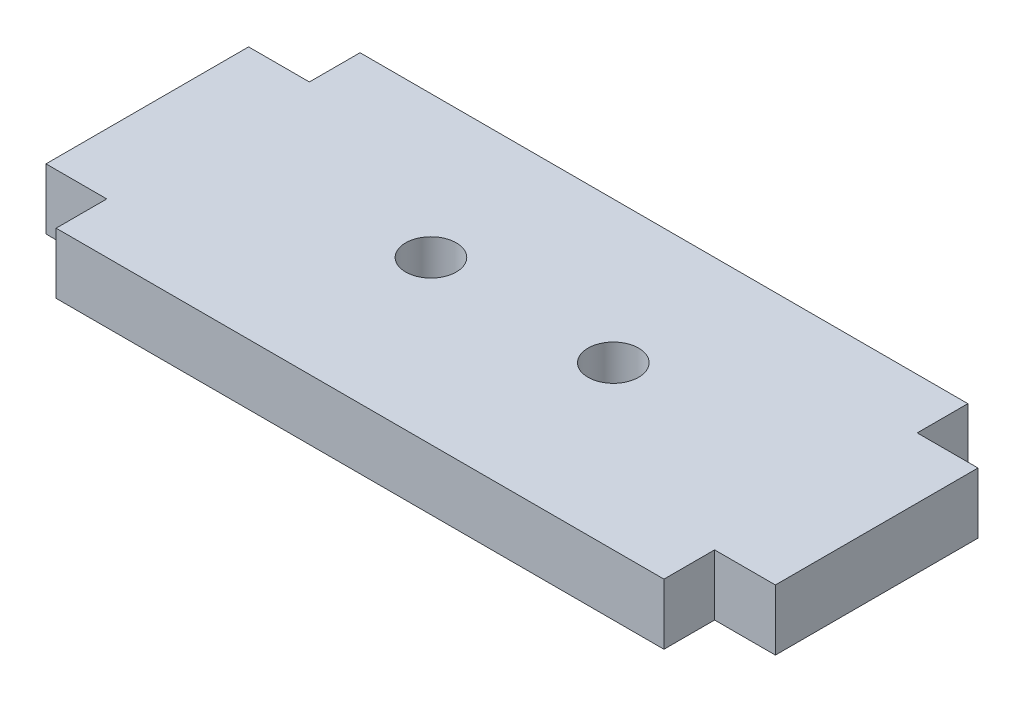
ISO-10303-21;
HEADER;
FILE_DESCRIPTION(('STEP AP214'),'2;1');
FILE_NAME('part.step','',(''),(''),'','','');
FILE_SCHEMA(('AUTOMOTIVE_DESIGN { 1 0 10303 214 1 1 1 1 }'));
ENDSEC;
DATA;
#1=APPLICATION_CONTEXT('core data for automotive mechanical design processes');
#2=APPLICATION_PROTOCOL_DEFINITION('international standard','automotive_design',2000,#1);
#3=PRODUCT_CONTEXT('',#1,'mechanical');
#4=PRODUCT('Part','Part','',(#3));
#5=PRODUCT_RELATED_PRODUCT_CATEGORY('part','',(#4));
#6=PRODUCT_DEFINITION_FORMATION('','',#4);
#7=PRODUCT_DEFINITION_CONTEXT('part definition',#1,'design');
#8=PRODUCT_DEFINITION('design','',#6,#7);
#9=PRODUCT_DEFINITION_SHAPE('','',#8);
#10=(LENGTH_UNIT() NAMED_UNIT(*) SI_UNIT(.MILLI.,.METRE.));
#11=(NAMED_UNIT(*) PLANE_ANGLE_UNIT() SI_UNIT($,.RADIAN.));
#12=(NAMED_UNIT(*) SI_UNIT($,.STERADIAN.) SOLID_ANGLE_UNIT());
#13=UNCERTAINTY_MEASURE_WITH_UNIT(LENGTH_MEASURE(1.E-05),#10,'distance_accuracy_value','');
#14=(GEOMETRIC_REPRESENTATION_CONTEXT(3) GLOBAL_UNCERTAINTY_ASSIGNED_CONTEXT((#13)) GLOBAL_UNIT_ASSIGNED_CONTEXT((#10,
#11,#12)) REPRESENTATION_CONTEXT('',''));
#15=CARTESIAN_POINT('',(0.,0.,0.));
#16=DIRECTION('',(0.,0.,1.));
#17=DIRECTION('',(1.,0.,0.));
#18=AXIS2_PLACEMENT_3D('',#15,#16,#17);
#19=CARTESIAN_POINT('',(0.,3.,0.));
#20=DIRECTION('',(0.,1.,0.));
#21=DIRECTION('',(0.,0.,1.));
#22=AXIS2_PLACEMENT_3D('',#19,#20,#21);
#23=PLANE('',#22);
#24=CARTESIAN_POINT('',(10.5,3.,-8.));
#25=DIRECTION('',(0.,1.,0.));
#26=DIRECTION('',(0.,0.,1.));
#27=AXIS2_PLACEMENT_3D('',#24,#25,#26);
#28=CIRCLE('',#27,1.25);
#29=CARTESIAN_POINT('',(10.5,3.,-6.75));
#30=VERTEX_POINT('',#29);
#31=EDGE_CURVE('E158',#30,#30,#28,.T.);
#32=ORIENTED_EDGE('',*,*,#31,.F.);
#33=EDGE_LOOP('',(#32));
#34=FACE_BOUND('',#33,.T.);
#35=DIRECTION('',(0.,0.,1.));
#36=VECTOR('',#35,1.);
#37=CARTESIAN_POINT('',(0.,3.,0.));
#38=LINE('',#37,#36);
#39=CARTESIAN_POINT('',(0.,3.,-2.5));
#40=VERTEX_POINT('',#39);
#41=CARTESIAN_POINT('',(0.,3.,0.));
#42=VERTEX_POINT('',#41);
#43=EDGE_CURVE('E177',#40,#42,#38,.T.);
#44=ORIENTED_EDGE('',*,*,#43,.T.);
#45=DIRECTION('',(1.,0.,0.));
#46=VECTOR('',#45,1.);
#47=CARTESIAN_POINT('',(0.,3.,0.));
#48=LINE('',#47,#46);
#49=CARTESIAN_POINT('',(30.,3.,0.));
#50=VERTEX_POINT('',#49);
#51=EDGE_CURVE('E105',#42,#50,#48,.T.);
#52=ORIENTED_EDGE('',*,*,#51,.T.);
#53=DIRECTION('',(0.,0.,-1.));
#54=VECTOR('',#53,1.);
#55=CARTESIAN_POINT('',(30.,3.,0.));
#56=LINE('',#55,#54);
#57=CARTESIAN_POINT('',(30.,3.,-2.5));
#58=VERTEX_POINT('',#57);
#59=EDGE_CURVE('E204',#50,#58,#56,.T.);
#60=ORIENTED_EDGE('',*,*,#59,.T.);
#61=DIRECTION('',(1.,0.,0.));
#62=VECTOR('',#61,1.);
#63=CARTESIAN_POINT('',(30.,3.,-2.5));
#64=LINE('',#63,#62);
#65=CARTESIAN_POINT('',(33.,3.,-2.5));
#66=VERTEX_POINT('',#65);
#67=EDGE_CURVE('E223',#58,#66,#64,.T.);
#68=ORIENTED_EDGE('',*,*,#67,.T.);
#69=DIRECTION('',(0.,0.,-1.));
#70=VECTOR('',#69,1.);
#71=CARTESIAN_POINT('',(33.,3.,-12.5));
#72=LINE('',#71,#70);
#73=CARTESIAN_POINT('',(33.,3.,-12.5));
#74=VERTEX_POINT('',#73);
#75=EDGE_CURVE('E220',#66,#74,#72,.T.);
#76=ORIENTED_EDGE('',*,*,#75,.T.);
#77=DIRECTION('',(-1.,0.,0.));
#78=VECTOR('',#77,1.);
#79=CARTESIAN_POINT('',(30.,3.,-12.5));
#80=LINE('',#79,#78);
#81=CARTESIAN_POINT('',(30.,3.,-12.5));
#82=VERTEX_POINT('',#81);
#83=EDGE_CURVE('E222',#74,#82,#80,.T.);
#84=ORIENTED_EDGE('',*,*,#83,.T.);
#85=DIRECTION('',(0.,0.,-1.));
#86=VECTOR('',#85,1.);
#87=CARTESIAN_POINT('',(30.,3.,-12.5));
#88=LINE('',#87,#86);
#89=CARTESIAN_POINT('',(30.,3.,-15.));
#90=VERTEX_POINT('',#89);
#91=EDGE_CURVE('E225',#82,#90,#88,.T.);
#92=ORIENTED_EDGE('',*,*,#91,.T.);
#93=DIRECTION('',(-1.,0.,0.));
#94=VECTOR('',#93,1.);
#95=CARTESIAN_POINT('',(0.,3.,-15.));
#96=LINE('',#95,#94);
#97=CARTESIAN_POINT('',(0.,3.,-15.));
#98=VERTEX_POINT('',#97);
#99=EDGE_CURVE('E231',#90,#98,#96,.T.);
#100=ORIENTED_EDGE('',*,*,#99,.T.);
#101=DIRECTION('',(0.,0.,1.));
#102=VECTOR('',#101,1.);
#103=CARTESIAN_POINT('',(0.,3.,-12.5));
#104=LINE('',#103,#102);
#105=CARTESIAN_POINT('',(0.,3.,-12.5));
#106=VERTEX_POINT('',#105);
#107=EDGE_CURVE('E136',#98,#106,#104,.T.);
#108=ORIENTED_EDGE('',*,*,#107,.T.);
#109=DIRECTION('',(-1.,0.,0.));
#110=VECTOR('',#109,1.);
#111=CARTESIAN_POINT('',(0.,3.,-12.5));
#112=LINE('',#111,#110);
#113=CARTESIAN_POINT('',(-3.,3.,-12.5));
#114=VERTEX_POINT('',#113);
#115=EDGE_CURVE('E130',#106,#114,#112,.T.);
#116=ORIENTED_EDGE('',*,*,#115,.T.);
#117=DIRECTION('',(0.,0.,1.));
#118=VECTOR('',#117,1.);
#119=CARTESIAN_POINT('',(-3.,3.,-12.5));
#120=LINE('',#119,#118);
#121=CARTESIAN_POINT('',(-3.,3.,-2.5));
#122=VERTEX_POINT('',#121);
#123=EDGE_CURVE('E134',#114,#122,#120,.T.);
#124=ORIENTED_EDGE('',*,*,#123,.T.);
#125=DIRECTION('',(1.,0.,0.));
#126=VECTOR('',#125,1.);
#127=CARTESIAN_POINT('',(0.,3.,-2.5));
#128=LINE('',#127,#126);
#129=EDGE_CURVE('E50',#122,#40,#128,.T.);
#130=ORIENTED_EDGE('',*,*,#129,.T.);
#131=EDGE_LOOP('',(#44,#52,#60,#68,#76,#84,#92,#100,#108,#116,#124,#130));
#132=FACE_BOUND('',#131,.T.);
#133=CARTESIAN_POINT('',(19.5,3.,-8.));
#134=DIRECTION('',(0.,1.,0.));
#135=DIRECTION('',(0.,0.,1.));
#136=AXIS2_PLACEMENT_3D('',#133,#134,#135);
#137=CIRCLE('',#136,1.25);
#138=CARTESIAN_POINT('',(19.5,3.,-6.75));
#139=VERTEX_POINT('',#138);
#140=EDGE_CURVE('E273',#139,#139,#137,.T.);
#141=ORIENTED_EDGE('',*,*,#140,.F.);
#142=EDGE_LOOP('',(#141));
#143=FACE_BOUND('',#142,.T.);
#144=ADVANCED_FACE('F33',(#34,#132,#143),#23,.T.);
#145=CARTESIAN_POINT('',(0.,0.,0.));
#146=DIRECTION('',(0.,1.,0.));
#147=DIRECTION('',(0.,0.,1.));
#148=AXIS2_PLACEMENT_3D('',#145,#146,#147);
#149=PLANE('',#148);
#150=DIRECTION('',(0.,0.,1.));
#151=VECTOR('',#150,1.);
#152=CARTESIAN_POINT('',(0.,0.,0.));
#153=LINE('',#152,#151);
#154=CARTESIAN_POINT('',(0.,0.,-2.5));
#155=VERTEX_POINT('',#154);
#156=CARTESIAN_POINT('',(0.,0.,0.));
#157=VERTEX_POINT('',#156);
#158=EDGE_CURVE('E154',#155,#157,#153,.T.);
#159=ORIENTED_EDGE('',*,*,#158,.F.);
#160=DIRECTION('',(1.,0.,0.));
#161=VECTOR('',#160,1.);
#162=CARTESIAN_POINT('',(0.,0.,-2.5));
#163=LINE('',#162,#161);
#164=CARTESIAN_POINT('',(-3.,0.,-2.5));
#165=VERTEX_POINT('',#164);
#166=EDGE_CURVE('E97',#165,#155,#163,.T.);
#167=ORIENTED_EDGE('',*,*,#166,.F.);
#168=DIRECTION('',(0.,0.,1.));
#169=VECTOR('',#168,1.);
#170=CARTESIAN_POINT('',(-3.,0.,-12.5));
#171=LINE('',#170,#169);
#172=CARTESIAN_POINT('',(-3.,0.,-12.5));
#173=VERTEX_POINT('',#172);
#174=EDGE_CURVE('E91',#173,#165,#171,.T.);
#175=ORIENTED_EDGE('',*,*,#174,.F.);
#176=DIRECTION('',(-1.,0.,0.));
#177=VECTOR('',#176,1.);
#178=CARTESIAN_POINT('',(0.,0.,-12.5));
#179=LINE('',#178,#177);
#180=CARTESIAN_POINT('',(0.,0.,-12.5));
#181=VERTEX_POINT('',#180);
#182=EDGE_CURVE('E144',#181,#173,#179,.T.);
#183=ORIENTED_EDGE('',*,*,#182,.F.);
#184=DIRECTION('',(0.,0.,1.));
#185=VECTOR('',#184,1.);
#186=CARTESIAN_POINT('',(0.,0.,-12.5));
#187=LINE('',#186,#185);
#188=CARTESIAN_POINT('',(0.,0.,-15.));
#189=VERTEX_POINT('',#188);
#190=EDGE_CURVE('E172',#189,#181,#187,.T.);
#191=ORIENTED_EDGE('',*,*,#190,.F.);
#192=DIRECTION('',(-1.,0.,0.));
#193=VECTOR('',#192,1.);
#194=CARTESIAN_POINT('',(0.,0.,-15.));
#195=LINE('',#194,#193);
#196=CARTESIAN_POINT('',(30.,0.,-15.));
#197=VERTEX_POINT('',#196);
#198=EDGE_CURVE('E170',#197,#189,#195,.T.);
#199=ORIENTED_EDGE('',*,*,#198,.F.);
#200=DIRECTION('',(0.,0.,-1.));
#201=VECTOR('',#200,1.);
#202=CARTESIAN_POINT('',(30.,0.,-12.5));
#203=LINE('',#202,#201);
#204=CARTESIAN_POINT('',(30.,0.,-12.5));
#205=VERTEX_POINT('',#204);
#206=EDGE_CURVE('E168',#205,#197,#203,.T.);
#207=ORIENTED_EDGE('',*,*,#206,.F.);
#208=DIRECTION('',(-1.,0.,0.));
#209=VECTOR('',#208,1.);
#210=CARTESIAN_POINT('',(30.,0.,-12.5));
#211=LINE('',#210,#209);
#212=CARTESIAN_POINT('',(33.,0.,-12.5));
#213=VERTEX_POINT('',#212);
#214=EDGE_CURVE('E166',#213,#205,#211,.T.);
#215=ORIENTED_EDGE('',*,*,#214,.F.);
#216=DIRECTION('',(0.,0.,-1.));
#217=VECTOR('',#216,1.);
#218=CARTESIAN_POINT('',(33.,0.,-12.5));
#219=LINE('',#218,#217);
#220=CARTESIAN_POINT('',(33.,0.,-2.5));
#221=VERTEX_POINT('',#220);
#222=EDGE_CURVE('E164',#221,#213,#219,.T.);
#223=ORIENTED_EDGE('',*,*,#222,.F.);
#224=DIRECTION('',(1.,0.,0.));
#225=VECTOR('',#224,1.);
#226=CARTESIAN_POINT('',(30.,0.,-2.5));
#227=LINE('',#226,#225);
#228=CARTESIAN_POINT('',(30.,0.,-2.5));
#229=VERTEX_POINT('',#228);
#230=EDGE_CURVE('E162',#229,#221,#227,.T.);
#231=ORIENTED_EDGE('',*,*,#230,.F.);
#232=DIRECTION('',(0.,0.,-1.));
#233=VECTOR('',#232,1.);
#234=CARTESIAN_POINT('',(30.,0.,0.));
#235=LINE('',#234,#233);
#236=CARTESIAN_POINT('',(30.,0.,0.));
#237=VERTEX_POINT('',#236);
#238=EDGE_CURVE('E160',#237,#229,#235,.T.);
#239=ORIENTED_EDGE('',*,*,#238,.F.);
#240=DIRECTION('',(1.,0.,0.));
#241=VECTOR('',#240,1.);
#242=CARTESIAN_POINT('',(0.,0.,0.));
#243=LINE('',#242,#241);
#244=EDGE_CURVE('E157',#157,#237,#243,.T.);
#245=ORIENTED_EDGE('',*,*,#244,.F.);
#246=EDGE_LOOP('',(#159,#167,#175,#183,#191,#199,#207,#215,#223,#231,#239,#245));
#247=FACE_BOUND('',#246,.T.);
#248=CARTESIAN_POINT('',(10.5,0.,-8.));
#249=DIRECTION('',(0.,1.,0.));
#250=DIRECTION('',(0.,0.,1.));
#251=AXIS2_PLACEMENT_3D('',#248,#249,#250);
#252=CIRCLE('',#251,1.25);
#253=CARTESIAN_POINT('',(10.5,0.,-6.75));
#254=VERTEX_POINT('',#253);
#255=EDGE_CURVE('E279',#254,#254,#252,.T.);
#256=ORIENTED_EDGE('',*,*,#255,.T.);
#257=EDGE_LOOP('',(#256));
#258=FACE_BOUND('',#257,.T.);
#259=CARTESIAN_POINT('',(19.5,0.,-8.));
#260=DIRECTION('',(0.,1.,0.));
#261=DIRECTION('',(0.,0.,1.));
#262=AXIS2_PLACEMENT_3D('',#259,#260,#261);
#263=CIRCLE('',#262,1.25);
#264=CARTESIAN_POINT('',(19.5,0.,-6.75));
#265=VERTEX_POINT('',#264);
#266=EDGE_CURVE('E276',#265,#265,#263,.T.);
#267=ORIENTED_EDGE('',*,*,#266,.T.);
#268=EDGE_LOOP('',(#267));
#269=FACE_BOUND('',#268,.T.);
#270=ADVANCED_FACE('F208',(#247,#258,#269),#149,.F.);
#271=CARTESIAN_POINT('',(0.,3.,0.));
#272=DIRECTION('',(1.,0.,0.));
#273=DIRECTION('',(0.,0.,-1.));
#274=AXIS2_PLACEMENT_3D('',#271,#272,#273);
#275=PLANE('',#274);
#276=ORIENTED_EDGE('',*,*,#158,.T.);
#277=DIRECTION('',(0.,-1.,0.));
#278=VECTOR('',#277,1.);
#279=CARTESIAN_POINT('',(0.,3.,0.));
#280=LINE('',#279,#278);
#281=EDGE_CURVE('E11',#42,#157,#280,.T.);
#282=ORIENTED_EDGE('',*,*,#281,.F.);
#283=ORIENTED_EDGE('',*,*,#43,.F.);
#284=DIRECTION('',(0.,-1.,0.));
#285=VECTOR('',#284,1.);
#286=CARTESIAN_POINT('',(0.,3.,-2.5));
#287=LINE('',#286,#285);
#288=EDGE_CURVE('E150',#40,#155,#287,.T.);
#289=ORIENTED_EDGE('',*,*,#288,.T.);
#290=EDGE_LOOP('',(#276,#282,#283,#289));
#291=FACE_BOUND('',#290,.T.);
#292=ADVANCED_FACE('F35',(#291),#275,.F.);
#293=CARTESIAN_POINT('',(0.,3.,0.));
#294=DIRECTION('',(0.,0.,-1.));
#295=DIRECTION('',(-1.,0.,0.));
#296=AXIS2_PLACEMENT_3D('',#293,#294,#295);
#297=PLANE('',#296);
#298=ORIENTED_EDGE('',*,*,#244,.T.);
#299=DIRECTION('',(0.,-1.,0.));
#300=VECTOR('',#299,1.);
#301=CARTESIAN_POINT('',(30.,3.,0.));
#302=LINE('',#301,#300);
#303=EDGE_CURVE('E42',#50,#237,#302,.T.);
#304=ORIENTED_EDGE('',*,*,#303,.F.);
#305=ORIENTED_EDGE('',*,*,#51,.F.);
#306=ORIENTED_EDGE('',*,*,#281,.T.);
#307=EDGE_LOOP('',(#298,#304,#305,#306));
#308=FACE_BOUND('',#307,.T.);
#309=ADVANCED_FACE('F372',(#308),#297,.F.);
#310=CARTESIAN_POINT('',(30.,3.,0.));
#311=DIRECTION('',(-1.,0.,0.));
#312=DIRECTION('',(0.,0.,1.));
#313=AXIS2_PLACEMENT_3D('',#310,#311,#312);
#314=PLANE('',#313);
#315=ORIENTED_EDGE('',*,*,#238,.T.);
#316=DIRECTION('',(0.,-1.,0.));
#317=VECTOR('',#316,1.);
#318=CARTESIAN_POINT('',(30.,3.,-2.5));
#319=LINE('',#318,#317);
#320=EDGE_CURVE('E196',#58,#229,#319,.T.);
#321=ORIENTED_EDGE('',*,*,#320,.F.);
#322=ORIENTED_EDGE('',*,*,#59,.F.);
#323=ORIENTED_EDGE('',*,*,#303,.T.);
#324=EDGE_LOOP('',(#315,#321,#322,#323));
#325=FACE_BOUND('',#324,.T.);
#326=ADVANCED_FACE('F202',(#325),#314,.F.);
#327=CARTESIAN_POINT('',(30.,3.,-2.5));
#328=DIRECTION('',(0.,0.,-1.));
#329=DIRECTION('',(-1.,0.,0.));
#330=AXIS2_PLACEMENT_3D('',#327,#328,#329);
#331=PLANE('',#330);
#332=ORIENTED_EDGE('',*,*,#230,.T.);
#333=DIRECTION('',(0.,-1.,0.));
#334=VECTOR('',#333,1.);
#335=CARTESIAN_POINT('',(33.,3.,-2.5));
#336=LINE('',#335,#334);
#337=EDGE_CURVE('E193',#66,#221,#336,.T.);
#338=ORIENTED_EDGE('',*,*,#337,.F.);
#339=ORIENTED_EDGE('',*,*,#67,.F.);
#340=ORIENTED_EDGE('',*,*,#320,.T.);
#341=EDGE_LOOP('',(#332,#338,#339,#340));
#342=FACE_BOUND('',#341,.T.);
#343=ADVANCED_FACE('F214',(#342),#331,.F.);
#344=CARTESIAN_POINT('',(33.,3.,-12.5));
#345=DIRECTION('',(-1.,0.,0.));
#346=DIRECTION('',(0.,0.,1.));
#347=AXIS2_PLACEMENT_3D('',#344,#345,#346);
#348=PLANE('',#347);
#349=ORIENTED_EDGE('',*,*,#222,.T.);
#350=DIRECTION('',(0.,-1.,0.));
#351=VECTOR('',#350,1.);
#352=CARTESIAN_POINT('',(33.,3.,-12.5));
#353=LINE('',#352,#351);
#354=EDGE_CURVE('E190',#74,#213,#353,.T.);
#355=ORIENTED_EDGE('',*,*,#354,.F.);
#356=ORIENTED_EDGE('',*,*,#75,.F.);
#357=ORIENTED_EDGE('',*,*,#337,.T.);
#358=EDGE_LOOP('',(#349,#355,#356,#357));
#359=FACE_BOUND('',#358,.T.);
#360=ADVANCED_FACE('F218',(#359),#348,.F.);
#361=CARTESIAN_POINT('',(30.,3.,-12.5));
#362=DIRECTION('',(0.,0.,1.));
#363=DIRECTION('',(1.,0.,0.));
#364=AXIS2_PLACEMENT_3D('',#361,#362,#363);
#365=PLANE('',#364);
#366=ORIENTED_EDGE('',*,*,#214,.T.);
#367=DIRECTION('',(0.,-1.,0.));
#368=VECTOR('',#367,1.);
#369=CARTESIAN_POINT('',(30.,3.,-12.5));
#370=LINE('',#369,#368);
#371=EDGE_CURVE('E187',#82,#205,#370,.T.);
#372=ORIENTED_EDGE('',*,*,#371,.F.);
#373=ORIENTED_EDGE('',*,*,#83,.F.);
#374=ORIENTED_EDGE('',*,*,#354,.T.);
#375=EDGE_LOOP('',(#366,#372,#373,#374));
#376=FACE_BOUND('',#375,.T.);
#377=ADVANCED_FACE('F337',(#376),#365,.F.);
#378=CARTESIAN_POINT('',(30.,3.,-12.5));
#379=DIRECTION('',(-1.,0.,0.));
#380=DIRECTION('',(0.,0.,1.));
#381=AXIS2_PLACEMENT_3D('',#378,#379,#380);
#382=PLANE('',#381);
#383=ORIENTED_EDGE('',*,*,#206,.T.);
#384=DIRECTION('',(0.,-1.,0.));
#385=VECTOR('',#384,1.);
#386=CARTESIAN_POINT('',(30.,3.,-15.));
#387=LINE('',#386,#385);
#388=EDGE_CURVE('E184',#90,#197,#387,.T.);
#389=ORIENTED_EDGE('',*,*,#388,.F.);
#390=ORIENTED_EDGE('',*,*,#91,.F.);
#391=ORIENTED_EDGE('',*,*,#371,.T.);
#392=EDGE_LOOP('',(#383,#389,#390,#391));
#393=FACE_BOUND('',#392,.T.);
#394=ADVANCED_FACE('F328',(#393),#382,.F.);
#395=CARTESIAN_POINT('',(0.,3.,-15.));
#396=DIRECTION('',(0.,0.,1.));
#397=DIRECTION('',(1.,0.,0.));
#398=AXIS2_PLACEMENT_3D('',#395,#396,#397);
#399=PLANE('',#398);
#400=ORIENTED_EDGE('',*,*,#198,.T.);
#401=DIRECTION('',(0.,-1.,0.));
#402=VECTOR('',#401,1.);
#403=CARTESIAN_POINT('',(0.,3.,-15.));
#404=LINE('',#403,#402);
#405=EDGE_CURVE('E181',#98,#189,#404,.T.);
#406=ORIENTED_EDGE('',*,*,#405,.F.);
#407=ORIENTED_EDGE('',*,*,#99,.F.);
#408=ORIENTED_EDGE('',*,*,#388,.T.);
#409=EDGE_LOOP('',(#400,#406,#407,#408));
#410=FACE_BOUND('',#409,.T.);
#411=ADVANCED_FACE('F237',(#410),#399,.F.);
#412=CARTESIAN_POINT('',(0.,3.,-12.5));
#413=DIRECTION('',(1.,0.,0.));
#414=DIRECTION('',(0.,0.,-1.));
#415=AXIS2_PLACEMENT_3D('',#412,#413,#414);
#416=PLANE('',#415);
#417=ORIENTED_EDGE('',*,*,#190,.T.);
#418=DIRECTION('',(0.,-1.,0.));
#419=VECTOR('',#418,1.);
#420=CARTESIAN_POINT('',(0.,3.,-12.5));
#421=LINE('',#420,#419);
#422=EDGE_CURVE('E145',#106,#181,#421,.T.);
#423=ORIENTED_EDGE('',*,*,#422,.F.);
#424=ORIENTED_EDGE('',*,*,#107,.F.);
#425=ORIENTED_EDGE('',*,*,#405,.T.);
#426=EDGE_LOOP('',(#417,#423,#424,#425));
#427=FACE_BOUND('',#426,.T.);
#428=ADVANCED_FACE('F241',(#427),#416,.F.);
#429=CARTESIAN_POINT('',(0.,3.,-12.5));
#430=DIRECTION('',(0.,0.,1.));
#431=DIRECTION('',(1.,0.,0.));
#432=AXIS2_PLACEMENT_3D('',#429,#430,#431);
#433=PLANE('',#432);
#434=ORIENTED_EDGE('',*,*,#182,.T.);
#435=DIRECTION('',(0.,-1.,0.));
#436=VECTOR('',#435,1.);
#437=CARTESIAN_POINT('',(-3.,3.,-12.5));
#438=LINE('',#437,#436);
#439=EDGE_CURVE('E141',#114,#173,#438,.T.);
#440=ORIENTED_EDGE('',*,*,#439,.F.);
#441=ORIENTED_EDGE('',*,*,#115,.F.);
#442=ORIENTED_EDGE('',*,*,#422,.T.);
#443=EDGE_LOOP('',(#434,#440,#441,#442));
#444=FACE_BOUND('',#443,.T.);
#445=ADVANCED_FACE('F142',(#444),#433,.F.);
#446=CARTESIAN_POINT('',(-3.,3.,-12.5));
#447=DIRECTION('',(1.,0.,0.));
#448=DIRECTION('',(0.,0.,-1.));
#449=AXIS2_PLACEMENT_3D('',#446,#447,#448);
#450=PLANE('',#449);
#451=ORIENTED_EDGE('',*,*,#174,.T.);
#452=DIRECTION('',(0.,-1.,0.));
#453=VECTOR('',#452,1.);
#454=CARTESIAN_POINT('',(-3.,3.,-2.5));
#455=LINE('',#454,#453);
#456=EDGE_CURVE('E146',#122,#165,#455,.T.);
#457=ORIENTED_EDGE('',*,*,#456,.F.);
#458=ORIENTED_EDGE('',*,*,#123,.F.);
#459=ORIENTED_EDGE('',*,*,#439,.T.);
#460=EDGE_LOOP('',(#451,#457,#458,#459));
#461=FACE_BOUND('',#460,.T.);
#462=ADVANCED_FACE('F148',(#461),#450,.F.);
#463=CARTESIAN_POINT('',(0.,3.,-2.5));
#464=DIRECTION('',(0.,0.,-1.));
#465=DIRECTION('',(-1.,0.,0.));
#466=AXIS2_PLACEMENT_3D('',#463,#464,#465);
#467=PLANE('',#466);
#468=ORIENTED_EDGE('',*,*,#166,.T.);
#469=ORIENTED_EDGE('',*,*,#288,.F.);
#470=ORIENTED_EDGE('',*,*,#129,.F.);
#471=ORIENTED_EDGE('',*,*,#456,.T.);
#472=EDGE_LOOP('',(#468,#469,#470,#471));
#473=FACE_BOUND('',#472,.T.);
#474=ADVANCED_FACE('F245',(#473),#467,.F.);
#475=CARTESIAN_POINT('',(10.5,3.,-8.));
#476=DIRECTION('',(0.,-1.,0.));
#477=DIRECTION('',(0.,0.,-1.));
#478=AXIS2_PLACEMENT_3D('',#475,#476,#477);
#479=CYLINDRICAL_SURFACE('',#478,1.25);
#480=ORIENTED_EDGE('',*,*,#31,.T.);
#481=EDGE_LOOP('',(#480));
#482=FACE_BOUND('',#481,.T.);
#483=ORIENTED_EDGE('',*,*,#255,.F.);
#484=EDGE_LOOP('',(#483));
#485=FACE_BOUND('',#484,.T.);
#486=ADVANCED_FACE('F247',(#482,#485),#479,.F.);
#487=CARTESIAN_POINT('',(19.5,3.,-8.));
#488=DIRECTION('',(0.,-1.,0.));
#489=DIRECTION('',(0.,0.,-1.));
#490=AXIS2_PLACEMENT_3D('',#487,#488,#489);
#491=CYLINDRICAL_SURFACE('',#490,1.25);
#492=ORIENTED_EDGE('',*,*,#140,.T.);
#493=EDGE_LOOP('',(#492));
#494=FACE_BOUND('',#493,.T.);
#495=ORIENTED_EDGE('',*,*,#266,.F.);
#496=EDGE_LOOP('',(#495));
#497=FACE_BOUND('',#496,.T.);
#498=ADVANCED_FACE('F253',(#494,#497),#491,.F.);
#499=CLOSED_SHELL('',(#144,#270,#292,#309,#326,#343,#360,#377,#394,#411,#428,#445,#462,#474,
#486,#498));
#500=MANIFOLD_SOLID_BREP('B2',#499);
#501=ADVANCED_BREP_SHAPE_REPRESENTATION('',(#18,#500),#14);
#502=SHAPE_DEFINITION_REPRESENTATION(#9,#501);
ENDSEC;
END-ISO-10303-21;
